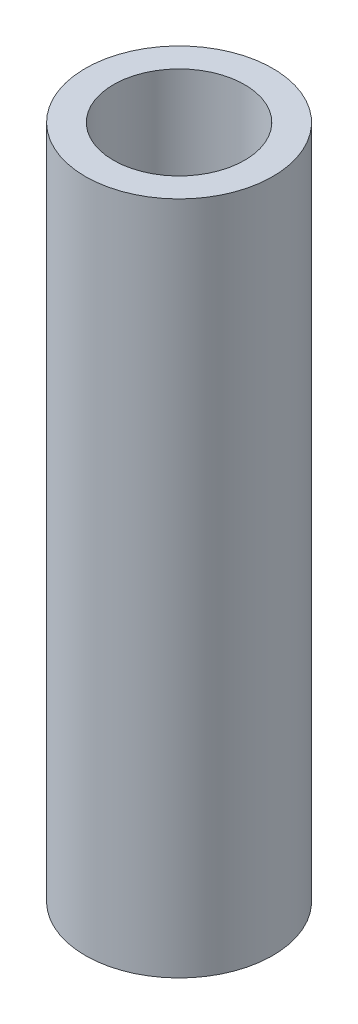
ISO-10303-21;
HEADER;
FILE_DESCRIPTION(('STEP AP214'),'2;1');
FILE_NAME('part.step','',(''),(''),'','','');
FILE_SCHEMA(('AUTOMOTIVE_DESIGN { 1 0 10303 214 1 1 1 1 }'));
ENDSEC;
DATA;
#1=APPLICATION_CONTEXT('core data for automotive mechanical design processes');
#2=APPLICATION_PROTOCOL_DEFINITION('international standard','automotive_design',2000,#1);
#3=PRODUCT_CONTEXT('',#1,'mechanical');
#4=PRODUCT('Part','Part','',(#3));
#5=PRODUCT_RELATED_PRODUCT_CATEGORY('part','',(#4));
#6=PRODUCT_DEFINITION_FORMATION('','',#4);
#7=PRODUCT_DEFINITION_CONTEXT('part definition',#1,'design');
#8=PRODUCT_DEFINITION('design','',#6,#7);
#9=PRODUCT_DEFINITION_SHAPE('','',#8);
#10=(LENGTH_UNIT() NAMED_UNIT(*) SI_UNIT(.MILLI.,.METRE.));
#11=(NAMED_UNIT(*) PLANE_ANGLE_UNIT() SI_UNIT($,.RADIAN.));
#12=(NAMED_UNIT(*) SI_UNIT($,.STERADIAN.) SOLID_ANGLE_UNIT());
#13=UNCERTAINTY_MEASURE_WITH_UNIT(LENGTH_MEASURE(1.E-05),#10,'distance_accuracy_value','');
#14=(GEOMETRIC_REPRESENTATION_CONTEXT(3) GLOBAL_UNCERTAINTY_ASSIGNED_CONTEXT((#13)) GLOBAL_UNIT_ASSIGNED_CONTEXT((#10,
#11,#12)) REPRESENTATION_CONTEXT('',''));
#15=CARTESIAN_POINT('',(0.,0.,0.));
#16=DIRECTION('',(0.,0.,1.));
#17=DIRECTION('',(1.,0.,0.));
#18=AXIS2_PLACEMENT_3D('',#15,#16,#17);
#19=CARTESIAN_POINT('',(0.,72.,0.));
#20=DIRECTION('',(0.,1.,0.));
#21=DIRECTION('',(0.,0.,1.));
#22=AXIS2_PLACEMENT_3D('',#19,#20,#21);
#23=PLANE('',#22);
#24=CARTESIAN_POINT('',(0.,72.,0.));
#25=DIRECTION('',(0.,1.,0.));
#26=DIRECTION('',(0.,0.,1.));
#27=AXIS2_PLACEMENT_3D('',#24,#25,#26);
#28=CIRCLE('',#27,10.);
#29=CARTESIAN_POINT('',(0.,72.,10.));
#30=VERTEX_POINT('',#29);
#31=EDGE_CURVE('E10',#30,#30,#28,.T.);
#32=ORIENTED_EDGE('',*,*,#31,.T.);
#33=EDGE_LOOP('',(#32));
#34=FACE_BOUND('',#33,.T.);
#35=CARTESIAN_POINT('',(0.,72.,0.));
#36=DIRECTION('',(0.,1.,0.));
#37=DIRECTION('',(0.,0.,1.));
#38=AXIS2_PLACEMENT_3D('',#35,#36,#37);
#39=CIRCLE('',#38,7.);
#40=CARTESIAN_POINT('',(0.,72.,7.));
#41=VERTEX_POINT('',#40);
#42=EDGE_CURVE('E41',#41,#41,#39,.T.);
#43=ORIENTED_EDGE('',*,*,#42,.F.);
#44=EDGE_LOOP('',(#43));
#45=FACE_BOUND('',#44,.T.);
#46=ADVANCED_FACE('F30',(#34,#45),#23,.T.);
#47=CARTESIAN_POINT('',(0.,0.,0.));
#48=DIRECTION('',(0.,1.,0.));
#49=DIRECTION('',(0.,0.,1.));
#50=AXIS2_PLACEMENT_3D('',#47,#48,#49);
#51=PLANE('',#50);
#52=CARTESIAN_POINT('',(0.,0.,0.));
#53=DIRECTION('',(0.,1.,0.));
#54=DIRECTION('',(0.,0.,1.));
#55=AXIS2_PLACEMENT_3D('',#52,#53,#54);
#56=CIRCLE('',#55,10.);
#57=CARTESIAN_POINT('',(0.,0.,10.));
#58=VERTEX_POINT('',#57);
#59=EDGE_CURVE('E34',#58,#58,#56,.T.);
#60=ORIENTED_EDGE('',*,*,#59,.F.);
#61=EDGE_LOOP('',(#60));
#62=FACE_BOUND('',#61,.T.);
#63=CARTESIAN_POINT('',(0.,0.,0.));
#64=DIRECTION('',(0.,1.,0.));
#65=DIRECTION('',(0.,0.,1.));
#66=AXIS2_PLACEMENT_3D('',#63,#64,#65);
#67=CIRCLE('',#66,7.);
#68=CARTESIAN_POINT('',(0.,0.,7.));
#69=VERTEX_POINT('',#68);
#70=EDGE_CURVE('E43',#69,#69,#67,.T.);
#71=ORIENTED_EDGE('',*,*,#70,.T.);
#72=EDGE_LOOP('',(#71));
#73=FACE_BOUND('',#72,.T.);
#74=ADVANCED_FACE('F53',(#62,#73),#51,.F.);
#75=CARTESIAN_POINT('',(0.,72.,0.));
#76=DIRECTION('',(0.,-1.,0.));
#77=DIRECTION('',(0.,0.,-1.));
#78=AXIS2_PLACEMENT_3D('',#75,#76,#77);
#79=CYLINDRICAL_SURFACE('',#78,10.);
#80=ORIENTED_EDGE('',*,*,#31,.F.);
#81=EDGE_LOOP('',(#80));
#82=FACE_BOUND('',#81,.T.);
#83=ORIENTED_EDGE('',*,*,#59,.T.);
#84=EDGE_LOOP('',(#83));
#85=FACE_BOUND('',#84,.T.);
#86=ADVANCED_FACE('F32',(#82,#85),#79,.T.);
#87=CARTESIAN_POINT('',(0.,72.,0.));
#88=DIRECTION('',(0.,-1.,0.));
#89=DIRECTION('',(0.,0.,-1.));
#90=AXIS2_PLACEMENT_3D('',#87,#88,#89);
#91=CYLINDRICAL_SURFACE('',#90,7.);
#92=ORIENTED_EDGE('',*,*,#42,.T.);
#93=EDGE_LOOP('',(#92));
#94=FACE_BOUND('',#93,.T.);
#95=ORIENTED_EDGE('',*,*,#70,.F.);
#96=EDGE_LOOP('',(#95));
#97=FACE_BOUND('',#96,.T.);
#98=ADVANCED_FACE('F49',(#94,#97),#91,.F.);
#99=CLOSED_SHELL('',(#46,#74,#86,#98));
#100=MANIFOLD_SOLID_BREP('B2',#99);
#101=ADVANCED_BREP_SHAPE_REPRESENTATION('',(#18,#100),#14);
#102=SHAPE_DEFINITION_REPRESENTATION(#9,#101);
ENDSEC;
END-ISO-10303-21;
